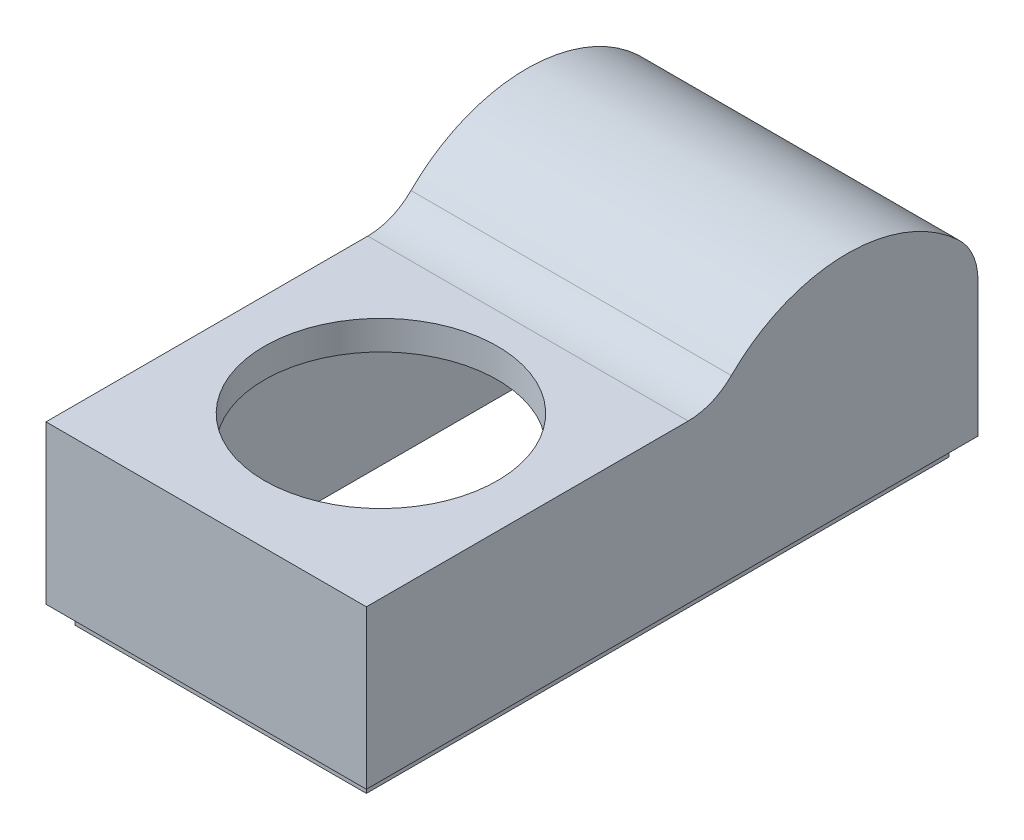
ISO-10303-21;
HEADER;
FILE_DESCRIPTION(('STEP AP214'),'2;1');
FILE_NAME('part.step','',(''),(''),'','','');
FILE_SCHEMA(('AUTOMOTIVE_DESIGN { 1 0 10303 214 1 1 1 1 }'));
ENDSEC;
DATA;
#1=APPLICATION_CONTEXT('core data for automotive mechanical design processes');
#2=APPLICATION_PROTOCOL_DEFINITION('international standard','automotive_design',2000,#1);
#3=PRODUCT_CONTEXT('',#1,'mechanical');
#4=PRODUCT('Part','Part','',(#3));
#5=PRODUCT_RELATED_PRODUCT_CATEGORY('part','',(#4));
#6=PRODUCT_DEFINITION_FORMATION('','',#4);
#7=PRODUCT_DEFINITION_CONTEXT('part definition',#1,'design');
#8=PRODUCT_DEFINITION('design','',#6,#7);
#9=PRODUCT_DEFINITION_SHAPE('','',#8);
#10=(LENGTH_UNIT() NAMED_UNIT(*) SI_UNIT(.MILLI.,.METRE.));
#11=(NAMED_UNIT(*) PLANE_ANGLE_UNIT() SI_UNIT($,.RADIAN.));
#12=(NAMED_UNIT(*) SI_UNIT($,.STERADIAN.) SOLID_ANGLE_UNIT());
#13=UNCERTAINTY_MEASURE_WITH_UNIT(LENGTH_MEASURE(1.E-05),#10,'distance_accuracy_value','');
#14=(GEOMETRIC_REPRESENTATION_CONTEXT(3) GLOBAL_UNCERTAINTY_ASSIGNED_CONTEXT((#13)) GLOBAL_UNIT_ASSIGNED_CONTEXT((#10,
#11,#12)) REPRESENTATION_CONTEXT('',''));
#15=CARTESIAN_POINT('',(0.,0.,0.));
#16=DIRECTION('',(0.,0.,1.));
#17=DIRECTION('',(1.,0.,0.));
#18=AXIS2_PLACEMENT_3D('',#15,#16,#17);
#19=CARTESIAN_POINT('',(0.,-9.74725,0.));
#20=DIRECTION('',(0.,1.,0.));
#21=DIRECTION('',(0.,0.,1.));
#22=AXIS2_PLACEMENT_3D('',#19,#20,#21);
#23=PLANE('',#22);
#24=DIRECTION('',(1.,0.,0.));
#25=VECTOR('',#24,1.);
#26=CARTESIAN_POINT('',(-12.7,-9.74725,-25.4));
#27=LINE('',#26,#25);
#28=CARTESIAN_POINT('',(-12.7,-9.74725,-25.4));
#29=VERTEX_POINT('',#28);
#30=CARTESIAN_POINT('',(-5.3975,-9.74725,-25.4));
#31=VERTEX_POINT('',#30);
#32=EDGE_CURVE('E49',#29,#31,#27,.T.);
#33=ORIENTED_EDGE('',*,*,#32,.F.);
#34=DIRECTION('',(0.,0.,-1.));
#35=VECTOR('',#34,1.);
#36=CARTESIAN_POINT('',(-12.7,-9.74725,25.4));
#37=LINE('',#36,#35);
#38=CARTESIAN_POINT('',(-12.7,-9.74725,25.4));
#39=VERTEX_POINT('',#38);
#40=EDGE_CURVE('E53',#39,#29,#37,.T.);
#41=ORIENTED_EDGE('',*,*,#40,.F.);
#42=DIRECTION('',(-1.,0.,0.));
#43=VECTOR('',#42,1.);
#44=CARTESIAN_POINT('',(12.7,-9.74725,25.4));
#45=LINE('',#44,#43);
#46=CARTESIAN_POINT('',(12.7,-9.74725,25.4));
#47=VERTEX_POINT('',#46);
#48=EDGE_CURVE('E251',#47,#39,#45,.T.);
#49=ORIENTED_EDGE('',*,*,#48,.F.);
#50=DIRECTION('',(0.,0.,1.));
#51=VECTOR('',#50,1.);
#52=CARTESIAN_POINT('',(12.7,-9.74725,-25.4));
#53=LINE('',#52,#51);
#54=CARTESIAN_POINT('',(12.7,-9.74725,-25.4));
#55=VERTEX_POINT('',#54);
#56=EDGE_CURVE('E248',#55,#47,#53,.T.);
#57=ORIENTED_EDGE('',*,*,#56,.F.);
#58=DIRECTION('',(1.,0.,0.));
#59=VECTOR('',#58,1.);
#60=CARTESIAN_POINT('',(5.3975,-9.74725,-25.4));
#61=LINE('',#60,#59);
#62=CARTESIAN_POINT('',(5.3975,-9.74725,-25.4));
#63=VERTEX_POINT('',#62);
#64=EDGE_CURVE('E245',#63,#55,#61,.T.);
#65=ORIENTED_EDGE('',*,*,#64,.F.);
#66=DIRECTION('',(0.,0.,-1.));
#67=VECTOR('',#66,1.);
#68=CARTESIAN_POINT('',(5.3975,-9.74725,-13.2188964238259));
#69=LINE('',#68,#67);
#70=CARTESIAN_POINT('',(5.3975,-9.74725,-26.67));
#71=VERTEX_POINT('',#70);
#72=EDGE_CURVE('E280',#63,#71,#69,.T.);
#73=ORIENTED_EDGE('',*,*,#72,.T.);
#74=DIRECTION('',(-1.,0.,0.));
#75=VECTOR('',#74,1.);
#76=CARTESIAN_POINT('',(-13.97,-9.74725,-26.67));
#77=LINE('',#76,#75);
#78=CARTESIAN_POINT('',(13.97,-9.74725,-26.67));
#79=VERTEX_POINT('',#78);
#80=EDGE_CURVE('E351',#79,#71,#77,.T.);
#81=ORIENTED_EDGE('',*,*,#80,.F.);
#82=DIRECTION('',(0.,0.,-1.));
#83=VECTOR('',#82,1.);
#84=CARTESIAN_POINT('',(13.97,-9.74725,-26.67));
#85=LINE('',#84,#83);
#86=CARTESIAN_POINT('',(13.97,-9.74725,26.67));
#87=VERTEX_POINT('',#86);
#88=EDGE_CURVE('E347',#87,#79,#85,.T.);
#89=ORIENTED_EDGE('',*,*,#88,.F.);
#90=DIRECTION('',(1.,0.,0.));
#91=VECTOR('',#90,1.);
#92=CARTESIAN_POINT('',(-13.97,-9.74725,26.67));
#93=LINE('',#92,#91);
#94=CARTESIAN_POINT('',(-13.97,-9.74725,26.67));
#95=VERTEX_POINT('',#94);
#96=EDGE_CURVE('E344',#95,#87,#93,.T.);
#97=ORIENTED_EDGE('',*,*,#96,.F.);
#98=DIRECTION('',(0.,0.,1.));
#99=VECTOR('',#98,1.);
#100=CARTESIAN_POINT('',(-13.97,-9.74725,-26.67));
#101=LINE('',#100,#99);
#102=CARTESIAN_POINT('',(-13.97,-9.74725,-26.67));
#103=VERTEX_POINT('',#102);
#104=EDGE_CURVE('E341',#103,#95,#101,.T.);
#105=ORIENTED_EDGE('',*,*,#104,.F.);
#106=CARTESIAN_POINT('',(-5.3975,-9.74725,-26.67));
#107=VERTEX_POINT('',#106);
#108=EDGE_CURVE('E350',#107,#103,#77,.T.);
#109=ORIENTED_EDGE('',*,*,#108,.F.);
#110=DIRECTION('',(0.,0.,-1.));
#111=VECTOR('',#110,1.);
#112=CARTESIAN_POINT('',(-5.3975,-9.74725,-13.2188964238259));
#113=LINE('',#112,#111);
#114=EDGE_CURVE('E203',#31,#107,#113,.T.);
#115=ORIENTED_EDGE('',*,*,#114,.F.);
#116=EDGE_LOOP('',(#33,#41,#49,#57,#65,#73,#81,#89,#97,#105,#109,#115));
#117=FACE_BOUND('',#116,.T.);
#118=ADVANCED_FACE('F33',(#117),#23,.F.);
#119=CARTESIAN_POINT('',(-13.97,9.74725,-26.67));
#120=DIRECTION('',(1.,0.,0.));
#121=DIRECTION('',(0.,0.,-1.));
#122=AXIS2_PLACEMENT_3D('',#119,#120,#121);
#123=PLANE('',#122);
#124=CARTESIAN_POINT('',(-13.97,-4.54025,-15.24));
#125=DIRECTION('',(1.,0.,0.));
#126=DIRECTION('',(0.,0.,-1.));
#127=AXIS2_PLACEMENT_3D('',#124,#125,#126);
#128=CIRCLE('',#127,14.2875);
#129=CARTESIAN_POINT('',(-13.97,5.92422779171323,-24.9676595744681));
#130=VERTEX_POINT('',#129);
#131=CARTESIAN_POINT('',(-13.97,5.58584223300971,-5.16056984058223));
#132=VERTEX_POINT('',#131);
#133=EDGE_CURVE('E332',#130,#132,#128,.T.);
#134=ORIENTED_EDGE('',*,*,#133,.F.);
#135=CARTESIAN_POINT('',(-13.97,2.01748941614029,-21.336));
#136=DIRECTION('',(1.,0.,0.));
#137=DIRECTION('',(0.,0.,-1.));
#138=AXIS2_PLACEMENT_3D('',#135,#136,#137);
#139=CIRCLE('',#138,5.334);
#140=CARTESIAN_POINT('',(-13.97,2.01748941614029,-26.67));
#141=VERTEX_POINT('',#140);
#142=EDGE_CURVE('E11',#130,#141,#139,.F.);
#143=ORIENTED_EDGE('',*,*,#142,.T.);
#144=DIRECTION('',(0.,-1.,0.));
#145=VECTOR('',#144,1.);
#146=CARTESIAN_POINT('',(-13.97,9.74725,-26.67));
#147=LINE('',#146,#145);
#148=EDGE_CURVE('E354',#141,#103,#147,.T.);
#149=ORIENTED_EDGE('',*,*,#148,.T.);
#150=ORIENTED_EDGE('',*,*,#104,.T.);
#151=DIRECTION('',(0.,-1.,0.));
#152=VECTOR('',#151,1.);
#153=CARTESIAN_POINT('',(-13.97,9.74725,26.67));
#154=LINE('',#153,#152);
#155=CARTESIAN_POINT('',(-13.97,4.03225,26.67));
#156=VERTEX_POINT('',#155);
#157=EDGE_CURVE('E361',#156,#95,#154,.T.);
#158=ORIENTED_EDGE('',*,*,#157,.F.);
#159=DIRECTION('',(0.,0.,1.));
#160=VECTOR('',#159,1.);
#161=CARTESIAN_POINT('',(-13.97,4.03225,0.));
#162=LINE('',#161,#160);
#163=CARTESIAN_POINT('',(-13.97,4.03225,-1.39758258106627));
#164=VERTEX_POINT('',#163);
#165=EDGE_CURVE('E330',#164,#156,#162,.T.);
#166=ORIENTED_EDGE('',*,*,#165,.F.);
#167=CARTESIAN_POINT('',(-13.97,9.36625,-1.39758258106627));
#168=DIRECTION('',(1.,0.,0.));
#169=DIRECTION('',(0.,0.,-1.));
#170=AXIS2_PLACEMENT_3D('',#167,#168,#169);
#171=CIRCLE('',#170,5.334);
#172=EDGE_CURVE('E370',#164,#132,#171,.T.);
#173=ORIENTED_EDGE('',*,*,#172,.T.);
#174=EDGE_LOOP('',(#134,#143,#149,#150,#158,#166,#173));
#175=FACE_BOUND('',#174,.T.);
#176=ADVANCED_FACE('F386',(#175),#123,.F.);
#177=CARTESIAN_POINT('',(13.97,9.74725,-26.67));
#178=DIRECTION('',(-1.,0.,0.));
#179=DIRECTION('',(0.,0.,1.));
#180=AXIS2_PLACEMENT_3D('',#177,#178,#179);
#181=PLANE('',#180);
#182=DIRECTION('',(0.,-1.,0.));
#183=VECTOR('',#182,1.);
#184=CARTESIAN_POINT('',(13.97,9.74725,-26.67));
#185=LINE('',#184,#183);
#186=CARTESIAN_POINT('',(13.97,2.01748941614029,-26.67));
#187=VERTEX_POINT('',#186);
#188=EDGE_CURVE('E357',#187,#79,#185,.T.);
#189=ORIENTED_EDGE('',*,*,#188,.F.);
#190=CARTESIAN_POINT('',(13.97,2.01748941614029,-21.336));
#191=DIRECTION('',(-1.,0.,0.));
#192=DIRECTION('',(0.,0.,1.));
#193=AXIS2_PLACEMENT_3D('',#190,#191,#192);
#194=CIRCLE('',#193,5.334);
#195=CARTESIAN_POINT('',(13.97,5.92422779171323,-24.9676595744681));
#196=VERTEX_POINT('',#195);
#197=EDGE_CURVE('E376',#187,#196,#194,.F.);
#198=ORIENTED_EDGE('',*,*,#197,.T.);
#199=CARTESIAN_POINT('',(13.97,-4.54025,-15.24));
#200=DIRECTION('',(1.,0.,0.));
#201=DIRECTION('',(0.,0.,-1.));
#202=AXIS2_PLACEMENT_3D('',#199,#200,#201);
#203=CIRCLE('',#202,14.2875);
#204=CARTESIAN_POINT('',(13.97,5.58584223300971,-5.16056984058224));
#205=VERTEX_POINT('',#204);
#206=EDGE_CURVE('E336',#205,#196,#203,.F.);
#207=ORIENTED_EDGE('',*,*,#206,.F.);
#208=CARTESIAN_POINT('',(13.97,9.36625,-1.39758258106627));
#209=DIRECTION('',(-1.,0.,0.));
#210=DIRECTION('',(0.,0.,1.));
#211=AXIS2_PLACEMENT_3D('',#208,#209,#210);
#212=CIRCLE('',#211,5.334);
#213=CARTESIAN_POINT('',(13.97,4.03225,-1.39758258106627));
#214=VERTEX_POINT('',#213);
#215=EDGE_CURVE('E368',#205,#214,#212,.T.);
#216=ORIENTED_EDGE('',*,*,#215,.T.);
#217=DIRECTION('',(0.,0.,-1.));
#218=VECTOR('',#217,1.);
#219=CARTESIAN_POINT('',(13.97,4.03225,0.));
#220=LINE('',#219,#218);
#221=CARTESIAN_POINT('',(13.97,4.03225,26.67));
#222=VERTEX_POINT('',#221);
#223=EDGE_CURVE('E296',#222,#214,#220,.T.);
#224=ORIENTED_EDGE('',*,*,#223,.F.);
#225=DIRECTION('',(0.,-1.,0.));
#226=VECTOR('',#225,1.);
#227=CARTESIAN_POINT('',(13.97,9.74725,26.67));
#228=LINE('',#227,#226);
#229=EDGE_CURVE('E359',#222,#87,#228,.T.);
#230=ORIENTED_EDGE('',*,*,#229,.T.);
#231=ORIENTED_EDGE('',*,*,#88,.T.);
#232=EDGE_LOOP('',(#189,#198,#207,#216,#224,#230,#231));
#233=FACE_BOUND('',#232,.T.);
#234=ADVANCED_FACE('F397',(#233),#181,.F.);
#235=CARTESIAN_POINT('',(-13.97,9.74725,26.67));
#236=DIRECTION('',(0.,0.,-1.));
#237=DIRECTION('',(-1.,0.,0.));
#238=AXIS2_PLACEMENT_3D('',#235,#236,#237);
#239=PLANE('',#238);
#240=ORIENTED_EDGE('',*,*,#229,.F.);
#241=DIRECTION('',(1.,0.,0.));
#242=VECTOR('',#241,1.);
#243=CARTESIAN_POINT('',(-56.2678643077875,4.03225,26.67));
#244=LINE('',#243,#242);
#245=EDGE_CURVE('E333',#156,#222,#244,.T.);
#246=ORIENTED_EDGE('',*,*,#245,.F.);
#247=ORIENTED_EDGE('',*,*,#157,.T.);
#248=ORIENTED_EDGE('',*,*,#96,.T.);
#249=EDGE_LOOP('',(#240,#246,#247,#248));
#250=FACE_BOUND('',#249,.T.);
#251=ADVANCED_FACE('F418',(#250),#239,.F.);
#252=CARTESIAN_POINT('',(-13.97,9.74725,-26.67));
#253=DIRECTION('',(0.,0.,1.));
#254=DIRECTION('',(1.,0.,0.));
#255=AXIS2_PLACEMENT_3D('',#252,#253,#254);
#256=PLANE('',#255);
#257=DIRECTION('',(1.,0.,0.));
#258=VECTOR('',#257,1.);
#259=CARTESIAN_POINT('',(5.3975,-8.15975,-26.67));
#260=LINE('',#259,#258);
#261=CARTESIAN_POINT('',(-5.3975,-8.15975,-26.67));
#262=VERTEX_POINT('',#261);
#263=CARTESIAN_POINT('',(5.3975,-8.15975,-26.67));
#264=VERTEX_POINT('',#263);
#265=EDGE_CURVE('E271',#262,#264,#260,.T.);
#266=ORIENTED_EDGE('',*,*,#265,.F.);
#267=DIRECTION('',(0.,1.,0.));
#268=VECTOR('',#267,1.);
#269=CARTESIAN_POINT('',(-5.3975,-9.74725,-26.67));
#270=LINE('',#269,#268);
#271=EDGE_CURVE('E274',#107,#262,#270,.T.);
#272=ORIENTED_EDGE('',*,*,#271,.F.);
#273=ORIENTED_EDGE('',*,*,#108,.T.);
#274=ORIENTED_EDGE('',*,*,#148,.F.);
#275=DIRECTION('',(1.,0.,0.));
#276=VECTOR('',#275,1.);
#277=CARTESIAN_POINT('',(-13.97,2.01748941614029,-26.67));
#278=LINE('',#277,#276);
#279=EDGE_CURVE('E373',#141,#187,#278,.T.);
#280=ORIENTED_EDGE('',*,*,#279,.T.);
#281=ORIENTED_EDGE('',*,*,#188,.T.);
#282=ORIENTED_EDGE('',*,*,#80,.T.);
#283=DIRECTION('',(0.,-1.,0.));
#284=VECTOR('',#283,1.);
#285=CARTESIAN_POINT('',(5.3975,-9.74725,-26.67));
#286=LINE('',#285,#284);
#287=EDGE_CURVE('E270',#264,#71,#286,.T.);
#288=ORIENTED_EDGE('',*,*,#287,.F.);
#289=EDGE_LOOP('',(#266,#272,#273,#274,#280,#281,#282,#288));
#290=FACE_BOUND('',#289,.T.);
#291=ADVANCED_FACE('F395',(#290),#256,.F.);
#292=CARTESIAN_POINT('',(-56.2678643077875,4.03225,0.));
#293=DIRECTION('',(0.,-1.,0.));
#294=DIRECTION('',(0.,0.,-1.));
#295=AXIS2_PLACEMENT_3D('',#292,#293,#294);
#296=PLANE('',#295);
#297=CARTESIAN_POINT('',(0.,4.03225,11.43));
#298=DIRECTION('',(0.,1.,0.));
#299=DIRECTION('',(0.,0.,1.));
#300=AXIS2_PLACEMENT_3D('',#297,#298,#299);
#301=CIRCLE('',#300,10.16);
#302=CARTESIAN_POINT('',(0.,4.03225,21.59));
#303=VERTEX_POINT('',#302);
#304=EDGE_CURVE('E288',#303,#303,#301,.T.);
#305=ORIENTED_EDGE('',*,*,#304,.F.);
#306=EDGE_LOOP('',(#305));
#307=FACE_BOUND('',#306,.T.);
#308=ORIENTED_EDGE('',*,*,#223,.T.);
#309=DIRECTION('',(-1.,0.,0.));
#310=VECTOR('',#309,1.);
#311=CARTESIAN_POINT('',(-13.97,4.03225,-1.39758258106627));
#312=LINE('',#311,#310);
#313=EDGE_CURVE('E366',#214,#164,#312,.T.);
#314=ORIENTED_EDGE('',*,*,#313,.T.);
#315=ORIENTED_EDGE('',*,*,#165,.T.);
#316=ORIENTED_EDGE('',*,*,#245,.T.);
#317=EDGE_LOOP('',(#308,#314,#315,#316));
#318=FACE_BOUND('',#317,.T.);
#319=ADVANCED_FACE('F420',(#307,#318),#296,.F.);
#320=CARTESIAN_POINT('',(-56.2678643077875,-4.54025,-15.24));
#321=DIRECTION('',(1.,0.,0.));
#322=DIRECTION('',(0.,0.,-1.));
#323=AXIS2_PLACEMENT_3D('',#320,#321,#322);
#324=CYLINDRICAL_SURFACE('',#323,14.2875);
#325=ORIENTED_EDGE('',*,*,#206,.T.);
#326=DIRECTION('',(1.,0.,0.));
#327=VECTOR('',#326,1.);
#328=CARTESIAN_POINT('',(-56.2678643077875,5.92422779171323,-24.9676595744681));
#329=LINE('',#328,#327);
#330=EDGE_CURVE('E42',#196,#130,#329,.F.);
#331=ORIENTED_EDGE('',*,*,#330,.T.);
#332=ORIENTED_EDGE('',*,*,#133,.T.);
#333=DIRECTION('',(1.,0.,0.));
#334=VECTOR('',#333,1.);
#335=CARTESIAN_POINT('',(-56.2678643077875,5.58584223300971,-5.16056984058222));
#336=LINE('',#335,#334);
#337=EDGE_CURVE('E363',#132,#205,#336,.T.);
#338=ORIENTED_EDGE('',*,*,#337,.T.);
#339=EDGE_LOOP('',(#325,#331,#332,#338));
#340=FACE_BOUND('',#339,.T.);
#341=ADVANCED_FACE('F381',(#340),#324,.T.);
#342=CARTESIAN_POINT('',(-56.2678643077875,9.36625,-1.39758258106626));
#343=DIRECTION('',(1.,0.,0.));
#344=DIRECTION('',(0.,0.,-1.));
#345=AXIS2_PLACEMENT_3D('',#342,#343,#344);
#346=CYLINDRICAL_SURFACE('',#345,5.334);
#347=ORIENTED_EDGE('',*,*,#172,.F.);
#348=ORIENTED_EDGE('',*,*,#313,.F.);
#349=ORIENTED_EDGE('',*,*,#215,.F.);
#350=ORIENTED_EDGE('',*,*,#337,.F.);
#351=EDGE_LOOP('',(#347,#348,#349,#350));
#352=FACE_BOUND('',#351,.T.);
#353=ADVANCED_FACE('F423',(#352),#346,.F.);
#354=CARTESIAN_POINT('',(-56.2678643077875,2.01748941614029,-21.336));
#355=DIRECTION('',(1.,0.,0.));
#356=DIRECTION('',(0.,0.,-1.));
#357=AXIS2_PLACEMENT_3D('',#354,#355,#356);
#358=CYLINDRICAL_SURFACE('',#357,5.334);
#359=ORIENTED_EDGE('',*,*,#142,.F.);
#360=ORIENTED_EDGE('',*,*,#330,.F.);
#361=ORIENTED_EDGE('',*,*,#197,.F.);
#362=ORIENTED_EDGE('',*,*,#279,.F.);
#363=EDGE_LOOP('',(#359,#360,#361,#362));
#364=FACE_BOUND('',#363,.T.);
#365=ADVANCED_FACE('F35',(#364),#358,.T.);
#366=CARTESIAN_POINT('',(-11.43,9.74725,-26.67));
#367=DIRECTION('',(1.,0.,0.));
#368=DIRECTION('',(0.,0.,-1.));
#369=AXIS2_PLACEMENT_3D('',#366,#367,#368);
#370=PLANE('',#369);
#371=CARTESIAN_POINT('',(-11.43,-4.54025,-15.24));
#372=DIRECTION('',(1.,0.,0.));
#373=DIRECTION('',(0.,0.,-1.));
#374=AXIS2_PLACEMENT_3D('',#371,#372,#373);
#375=CIRCLE('',#374,11.7475);
#376=CARTESIAN_POINT('',(-11.43,4.06387618429754,-23.2382978723404));
#377=VERTEX_POINT('',#376);
#378=CARTESIAN_POINT('',(-11.43,3.78564805825243,-6.95246853558983));
#379=VERTEX_POINT('',#378);
#380=EDGE_CURVE('E291',#377,#379,#375,.T.);
#381=ORIENTED_EDGE('',*,*,#380,.T.);
#382=CARTESIAN_POINT('',(-11.43,9.36625,-1.39758258106627));
#383=DIRECTION('',(1.,0.,0.));
#384=DIRECTION('',(0.,0.,-1.));
#385=AXIS2_PLACEMENT_3D('',#382,#383,#384);
#386=CIRCLE('',#385,7.874);
#387=CARTESIAN_POINT('',(-11.43,1.49225000000001,-1.39758258106627));
#388=VERTEX_POINT('',#387);
#389=EDGE_CURVE('E306',#388,#379,#386,.T.);
#390=ORIENTED_EDGE('',*,*,#389,.F.);
#391=DIRECTION('',(0.,0.,1.));
#392=VECTOR('',#391,1.);
#393=CARTESIAN_POINT('',(-11.43,1.49225000000001,0.));
#394=LINE('',#393,#392);
#395=CARTESIAN_POINT('',(-11.43,1.49225000000001,24.13));
#396=VERTEX_POINT('',#395);
#397=EDGE_CURVE('E293',#388,#396,#394,.T.);
#398=ORIENTED_EDGE('',*,*,#397,.T.);
#399=DIRECTION('',(0.,-1.,0.));
#400=VECTOR('',#399,1.);
#401=CARTESIAN_POINT('',(-11.43,9.74725,24.13));
#402=LINE('',#401,#400);
#403=CARTESIAN_POINT('',(-11.43,-11.33475,24.13));
#404=VERTEX_POINT('',#403);
#405=EDGE_CURVE('E300',#396,#404,#402,.T.);
#406=ORIENTED_EDGE('',*,*,#405,.T.);
#407=DIRECTION('',(0.,0.,1.));
#408=VECTOR('',#407,1.);
#409=CARTESIAN_POINT('',(-11.43,-11.33475,-24.13));
#410=LINE('',#409,#408);
#411=CARTESIAN_POINT('',(-11.43,-11.33475,-24.13));
#412=VERTEX_POINT('',#411);
#413=EDGE_CURVE('E214',#412,#404,#410,.T.);
#414=ORIENTED_EDGE('',*,*,#413,.F.);
#415=DIRECTION('',(0.,-1.,0.));
#416=VECTOR('',#415,1.);
#417=CARTESIAN_POINT('',(-11.43,9.74725,-24.13));
#418=LINE('',#417,#416);
#419=CARTESIAN_POINT('',(-11.43,2.01748941614029,-24.13));
#420=VERTEX_POINT('',#419);
#421=EDGE_CURVE('E210',#420,#412,#418,.T.);
#422=ORIENTED_EDGE('',*,*,#421,.F.);
#423=CARTESIAN_POINT('',(-11.43,2.01748941614029,-21.336));
#424=DIRECTION('',(1.,0.,0.));
#425=DIRECTION('',(0.,0.,-1.));
#426=AXIS2_PLACEMENT_3D('',#423,#424,#425);
#427=CIRCLE('',#426,2.794);
#428=EDGE_CURVE('E294',#377,#420,#427,.F.);
#429=ORIENTED_EDGE('',*,*,#428,.F.);
#430=EDGE_LOOP('',(#381,#390,#398,#406,#414,#422,#429));
#431=FACE_BOUND('',#430,.T.);
#432=ADVANCED_FACE('F429',(#431),#370,.T.);
#433=CARTESIAN_POINT('',(11.43,9.74725,-26.67));
#434=DIRECTION('',(-1.,0.,0.));
#435=DIRECTION('',(0.,0.,1.));
#436=AXIS2_PLACEMENT_3D('',#433,#434,#435);
#437=PLANE('',#436);
#438=DIRECTION('',(0.,-1.,0.));
#439=VECTOR('',#438,1.);
#440=CARTESIAN_POINT('',(11.43,9.74725,-24.13));
#441=LINE('',#440,#439);
#442=CARTESIAN_POINT('',(11.43,2.01748941614029,-24.13));
#443=VERTEX_POINT('',#442);
#444=CARTESIAN_POINT('',(11.43,-11.33475,-24.13));
#445=VERTEX_POINT('',#444);
#446=EDGE_CURVE('E299',#443,#445,#441,.T.);
#447=ORIENTED_EDGE('',*,*,#446,.T.);
#448=DIRECTION('',(0.,0.,-1.));
#449=VECTOR('',#448,1.);
#450=CARTESIAN_POINT('',(11.43,-11.33475,24.13));
#451=LINE('',#450,#449);
#452=CARTESIAN_POINT('',(11.43,-11.33475,24.13));
#453=VERTEX_POINT('',#452);
#454=EDGE_CURVE('E227',#453,#445,#451,.T.);
#455=ORIENTED_EDGE('',*,*,#454,.F.);
#456=DIRECTION('',(0.,-1.,0.));
#457=VECTOR('',#456,1.);
#458=CARTESIAN_POINT('',(11.43,9.74725,24.13));
#459=LINE('',#458,#457);
#460=CARTESIAN_POINT('',(11.43,1.49225000000001,24.13));
#461=VERTEX_POINT('',#460);
#462=EDGE_CURVE('E303',#461,#453,#459,.T.);
#463=ORIENTED_EDGE('',*,*,#462,.F.);
#464=DIRECTION('',(0.,0.,-1.));
#465=VECTOR('',#464,1.);
#466=CARTESIAN_POINT('',(11.43,1.49225000000001,0.));
#467=LINE('',#466,#465);
#468=CARTESIAN_POINT('',(11.43,1.49225000000001,-1.39758258106627));
#469=VERTEX_POINT('',#468);
#470=EDGE_CURVE('E319',#461,#469,#467,.T.);
#471=ORIENTED_EDGE('',*,*,#470,.T.);
#472=CARTESIAN_POINT('',(11.43,9.36625,-1.39758258106627));
#473=DIRECTION('',(-1.,0.,0.));
#474=DIRECTION('',(0.,0.,1.));
#475=AXIS2_PLACEMENT_3D('',#472,#473,#474);
#476=CIRCLE('',#475,7.874);
#477=CARTESIAN_POINT('',(11.43,3.78564805825243,-6.95246853558984));
#478=VERTEX_POINT('',#477);
#479=EDGE_CURVE('E310',#478,#469,#476,.T.);
#480=ORIENTED_EDGE('',*,*,#479,.F.);
#481=CARTESIAN_POINT('',(11.43,-4.54025,-15.24));
#482=DIRECTION('',(-1.,0.,0.));
#483=DIRECTION('',(0.,0.,1.));
#484=AXIS2_PLACEMENT_3D('',#481,#482,#483);
#485=CIRCLE('',#484,11.7475);
#486=CARTESIAN_POINT('',(11.43,4.06387618429754,-23.2382978723404));
#487=VERTEX_POINT('',#486);
#488=EDGE_CURVE('E313',#478,#487,#485,.T.);
#489=ORIENTED_EDGE('',*,*,#488,.T.);
#490=CARTESIAN_POINT('',(11.43,2.01748941614029,-21.336));
#491=DIRECTION('',(-1.,0.,0.));
#492=DIRECTION('',(0.,0.,1.));
#493=AXIS2_PLACEMENT_3D('',#490,#491,#492);
#494=CIRCLE('',#493,2.794);
#495=EDGE_CURVE('E315',#443,#487,#494,.F.);
#496=ORIENTED_EDGE('',*,*,#495,.F.);
#497=EDGE_LOOP('',(#447,#455,#463,#471,#480,#489,#496));
#498=FACE_BOUND('',#497,.T.);
#499=ADVANCED_FACE('F629',(#498),#437,.T.);
#500=CARTESIAN_POINT('',(-13.97,9.74725,24.13));
#501=DIRECTION('',(0.,0.,-1.));
#502=DIRECTION('',(-1.,0.,0.));
#503=AXIS2_PLACEMENT_3D('',#500,#501,#502);
#504=PLANE('',#503);
#505=ORIENTED_EDGE('',*,*,#462,.T.);
#506=DIRECTION('',(1.,0.,0.));
#507=VECTOR('',#506,1.);
#508=CARTESIAN_POINT('',(-11.43,-11.33475,24.13));
#509=LINE('',#508,#507);
#510=EDGE_CURVE('E224',#404,#453,#509,.T.);
#511=ORIENTED_EDGE('',*,*,#510,.F.);
#512=ORIENTED_EDGE('',*,*,#405,.F.);
#513=DIRECTION('',(1.,0.,0.));
#514=VECTOR('',#513,1.);
#515=CARTESIAN_POINT('',(-56.2678643077875,1.49225000000001,24.13));
#516=LINE('',#515,#514);
#517=EDGE_CURVE('E305',#396,#461,#516,.T.);
#518=ORIENTED_EDGE('',*,*,#517,.T.);
#519=EDGE_LOOP('',(#505,#511,#512,#518));
#520=FACE_BOUND('',#519,.T.);
#521=ADVANCED_FACE('F617',(#520),#504,.T.);
#522=CARTESIAN_POINT('',(-13.97,9.74725,-24.13));
#523=DIRECTION('',(0.,0.,1.));
#524=DIRECTION('',(1.,0.,0.));
#525=AXIS2_PLACEMENT_3D('',#522,#523,#524);
#526=PLANE('',#525);
#527=DIRECTION('',(0.,1.,0.));
#528=VECTOR('',#527,1.);
#529=CARTESIAN_POINT('',(-5.3975,-9.74725,-24.13));
#530=LINE('',#529,#528);
#531=CARTESIAN_POINT('',(-5.3975,-11.33475,-24.13));
#532=VERTEX_POINT('',#531);
#533=CARTESIAN_POINT('',(-5.3975,-8.15975,-24.13));
#534=VERTEX_POINT('',#533);
#535=EDGE_CURVE('E193',#532,#534,#530,.T.);
#536=ORIENTED_EDGE('',*,*,#535,.T.);
#537=DIRECTION('',(1.,0.,0.));
#538=VECTOR('',#537,1.);
#539=CARTESIAN_POINT('',(5.3975,-8.15975,-24.13));
#540=LINE('',#539,#538);
#541=CARTESIAN_POINT('',(5.3975,-8.15975,-24.13));
#542=VERTEX_POINT('',#541);
#543=EDGE_CURVE('E282',#534,#542,#540,.T.);
#544=ORIENTED_EDGE('',*,*,#543,.T.);
#545=DIRECTION('',(0.,-1.,0.));
#546=VECTOR('',#545,1.);
#547=CARTESIAN_POINT('',(5.3975,-9.74725,-24.13));
#548=LINE('',#547,#546);
#549=CARTESIAN_POINT('',(5.3975,-11.33475,-24.13));
#550=VERTEX_POINT('',#549);
#551=EDGE_CURVE('E278',#542,#550,#548,.T.);
#552=ORIENTED_EDGE('',*,*,#551,.T.);
#553=DIRECTION('',(-1.,0.,0.));
#554=VECTOR('',#553,1.);
#555=CARTESIAN_POINT('',(11.43,-11.33475,-24.13));
#556=LINE('',#555,#554);
#557=EDGE_CURVE('E230',#445,#550,#556,.T.);
#558=ORIENTED_EDGE('',*,*,#557,.F.);
#559=ORIENTED_EDGE('',*,*,#446,.F.);
#560=DIRECTION('',(1.,0.,0.));
#561=VECTOR('',#560,1.);
#562=CARTESIAN_POINT('',(-13.97,2.01748941614029,-24.13));
#563=LINE('',#562,#561);
#564=EDGE_CURVE('E309',#420,#443,#563,.T.);
#565=ORIENTED_EDGE('',*,*,#564,.F.);
#566=ORIENTED_EDGE('',*,*,#421,.T.);
#567=DIRECTION('',(-1.,0.,0.));
#568=VECTOR('',#567,1.);
#569=CARTESIAN_POINT('',(-5.3975,-11.33475,-24.13));
#570=LINE('',#569,#568);
#571=EDGE_CURVE('E206',#532,#412,#570,.T.);
#572=ORIENTED_EDGE('',*,*,#571,.F.);
#573=EDGE_LOOP('',(#536,#544,#552,#558,#559,#565,#566,#572));
#574=FACE_BOUND('',#573,.T.);
#575=ADVANCED_FACE('F207',(#574),#526,.T.);
#576=CARTESIAN_POINT('',(-56.2678643077875,1.49225000000001,0.));
#577=DIRECTION('',(0.,-1.,0.));
#578=DIRECTION('',(0.,0.,-1.));
#579=AXIS2_PLACEMENT_3D('',#576,#577,#578);
#580=PLANE('',#579);
#581=CARTESIAN_POINT('',(0.,1.49225,11.43));
#582=DIRECTION('',(0.,-1.,0.));
#583=DIRECTION('',(0.,0.,-1.));
#584=AXIS2_PLACEMENT_3D('',#581,#582,#583);
#585=CIRCLE('',#584,10.16);
#586=CARTESIAN_POINT('',(0.,1.49225,21.59));
#587=VERTEX_POINT('',#586);
#588=EDGE_CURVE('E37',#587,#587,#585,.T.);
#589=ORIENTED_EDGE('',*,*,#588,.F.);
#590=EDGE_LOOP('',(#589));
#591=FACE_BOUND('',#590,.T.);
#592=ORIENTED_EDGE('',*,*,#470,.F.);
#593=ORIENTED_EDGE('',*,*,#517,.F.);
#594=ORIENTED_EDGE('',*,*,#397,.F.);
#595=DIRECTION('',(1.,0.,0.));
#596=VECTOR('',#595,1.);
#597=CARTESIAN_POINT('',(-56.2678643077875,1.49225000000001,-1.39758258106627));
#598=LINE('',#597,#596);
#599=EDGE_CURVE('E321',#469,#388,#598,.F.);
#600=ORIENTED_EDGE('',*,*,#599,.F.);
#601=EDGE_LOOP('',(#592,#593,#594,#600));
#602=FACE_BOUND('',#601,.T.);
#603=ADVANCED_FACE('F490',(#591,#602),#580,.T.);
#604=CARTESIAN_POINT('',(-56.2678643077875,-4.54025,-15.24));
#605=DIRECTION('',(1.,0.,0.));
#606=DIRECTION('',(0.,0.,-1.));
#607=AXIS2_PLACEMENT_3D('',#604,#605,#606);
#608=CYLINDRICAL_SURFACE('',#607,11.7475);
#609=ORIENTED_EDGE('',*,*,#488,.F.);
#610=DIRECTION('',(1.,0.,0.));
#611=VECTOR('',#610,1.);
#612=CARTESIAN_POINT('',(-56.2678643077875,3.78564805825243,-6.95246853558982));
#613=LINE('',#612,#611);
#614=EDGE_CURVE('E302',#379,#478,#613,.T.);
#615=ORIENTED_EDGE('',*,*,#614,.F.);
#616=ORIENTED_EDGE('',*,*,#380,.F.);
#617=DIRECTION('',(1.,0.,0.));
#618=VECTOR('',#617,1.);
#619=CARTESIAN_POINT('',(-56.2678643077875,4.06387618429754,-23.2382978723404));
#620=LINE('',#619,#618);
#621=EDGE_CURVE('E297',#487,#377,#620,.F.);
#622=ORIENTED_EDGE('',*,*,#621,.F.);
#623=EDGE_LOOP('',(#609,#615,#616,#622));
#624=FACE_BOUND('',#623,.T.);
#625=ADVANCED_FACE('F484',(#624),#608,.F.);
#626=CARTESIAN_POINT('',(-56.2678643077875,9.36625,-1.39758258106626));
#627=DIRECTION('',(1.,0.,0.));
#628=DIRECTION('',(0.,0.,-1.));
#629=AXIS2_PLACEMENT_3D('',#626,#627,#628);
#630=CYLINDRICAL_SURFACE('',#629,7.874);
#631=ORIENTED_EDGE('',*,*,#389,.T.);
#632=ORIENTED_EDGE('',*,*,#614,.T.);
#633=ORIENTED_EDGE('',*,*,#479,.T.);
#634=ORIENTED_EDGE('',*,*,#599,.T.);
#635=EDGE_LOOP('',(#631,#632,#633,#634));
#636=FACE_BOUND('',#635,.T.);
#637=ADVANCED_FACE('F489',(#636),#630,.T.);
#638=CARTESIAN_POINT('',(-56.2678643077875,2.01748941614029,-21.336));
#639=DIRECTION('',(1.,0.,0.));
#640=DIRECTION('',(0.,0.,-1.));
#641=AXIS2_PLACEMENT_3D('',#638,#639,#640);
#642=CYLINDRICAL_SURFACE('',#641,2.794);
#643=ORIENTED_EDGE('',*,*,#428,.T.);
#644=ORIENTED_EDGE('',*,*,#564,.T.);
#645=ORIENTED_EDGE('',*,*,#495,.T.);
#646=ORIENTED_EDGE('',*,*,#621,.T.);
#647=EDGE_LOOP('',(#643,#644,#645,#646));
#648=FACE_BOUND('',#647,.T.);
#649=ADVANCED_FACE('F501',(#648),#642,.F.);
#650=CARTESIAN_POINT('',(0.,-20.09775,11.43));
#651=DIRECTION('',(0.,1.,0.));
#652=DIRECTION('',(0.,0.,1.));
#653=AXIS2_PLACEMENT_3D('',#650,#651,#652);
#654=CYLINDRICAL_SURFACE('',#653,10.16);
#655=CARTESIAN_POINT('',(0.,1.49225,21.59));
#656=CARTESIAN_POINT('',(0.,1.51870833333333,21.59));
#657=CARTESIAN_POINT('',(0.,1.54516666666667,21.59));
#658=CARTESIAN_POINT('',(0.,1.59808333333333,21.59));
#659=CARTESIAN_POINT('',(0.,1.62454166666667,21.59));
#660=CARTESIAN_POINT('',(0.,1.67745833333333,21.59));
#661=CARTESIAN_POINT('',(0.,1.70391666666667,21.59));
#662=CARTESIAN_POINT('',(0.,1.75683333333333,21.59));
#663=CARTESIAN_POINT('',(0.,1.78329166666667,21.59));
#664=CARTESIAN_POINT('',(0.,1.83620833333333,21.59));
#665=CARTESIAN_POINT('',(0.,1.86266666666667,21.59));
#666=CARTESIAN_POINT('',(0.,1.91558333333334,21.59));
#667=CARTESIAN_POINT('',(0.,1.94204166666667,21.59));
#668=CARTESIAN_POINT('',(0.,1.99495833333333,21.59));
#669=CARTESIAN_POINT('',(0.,2.02141666666667,21.59));
#670=CARTESIAN_POINT('',(0.,2.07433333333333,21.59));
#671=CARTESIAN_POINT('',(0.,2.10079166666667,21.59));
#672=CARTESIAN_POINT('',(0.,2.15370833333333,21.59));
#673=CARTESIAN_POINT('',(0.,2.18016666666667,21.59));
#674=CARTESIAN_POINT('',(0.,2.23308333333333,21.59));
#675=CARTESIAN_POINT('',(0.,2.25954166666667,21.59));
#676=CARTESIAN_POINT('',(0.,2.31245833333333,21.59));
#677=CARTESIAN_POINT('',(0.,2.33891666666667,21.59));
#678=CARTESIAN_POINT('',(0.,2.39183333333333,21.59));
#679=CARTESIAN_POINT('',(0.,2.41829166666667,21.59));
#680=CARTESIAN_POINT('',(0.,2.47120833333334,21.59));
#681=CARTESIAN_POINT('',(0.,2.49766666666667,21.59));
#682=CARTESIAN_POINT('',(0.,2.55058333333334,21.59));
#683=CARTESIAN_POINT('',(0.,2.57704166666667,21.59));
#684=CARTESIAN_POINT('',(0.,2.62995833333333,21.59));
#685=CARTESIAN_POINT('',(0.,2.65641666666667,21.59));
#686=CARTESIAN_POINT('',(0.,2.70933333333333,21.59));
#687=CARTESIAN_POINT('',(0.,2.73579166666667,21.59));
#688=CARTESIAN_POINT('',(0.,2.78870833333333,21.59));
#689=CARTESIAN_POINT('',(0.,2.81516666666667,21.59));
#690=CARTESIAN_POINT('',(0.,2.86808333333333,21.59));
#691=CARTESIAN_POINT('',(0.,2.89454166666667,21.59));
#692=CARTESIAN_POINT('',(0.,2.94745833333333,21.59));
#693=CARTESIAN_POINT('',(0.,2.97391666666667,21.59));
#694=CARTESIAN_POINT('',(0.,3.02683333333333,21.59));
#695=CARTESIAN_POINT('',(0.,3.05329166666667,21.59));
#696=CARTESIAN_POINT('',(0.,3.10620833333333,21.59));
#697=CARTESIAN_POINT('',(0.,3.13266666666667,21.59));
#698=CARTESIAN_POINT('',(0.,3.18558333333334,21.59));
#699=CARTESIAN_POINT('',(0.,3.21204166666667,21.59));
#700=CARTESIAN_POINT('',(0.,3.26495833333334,21.59));
#701=CARTESIAN_POINT('',(0.,3.29141666666667,21.59));
#702=CARTESIAN_POINT('',(0.,3.34433333333333,21.59));
#703=CARTESIAN_POINT('',(0.,3.37079166666667,21.59));
#704=CARTESIAN_POINT('',(0.,3.42370833333333,21.59));
#705=CARTESIAN_POINT('',(0.,3.45016666666667,21.59));
#706=CARTESIAN_POINT('',(0.,3.50308333333333,21.59));
#707=CARTESIAN_POINT('',(0.,3.52954166666667,21.59));
#708=CARTESIAN_POINT('',(0.,3.58245833333333,21.59));
#709=CARTESIAN_POINT('',(0.,3.60891666666667,21.59));
#710=CARTESIAN_POINT('',(0.,3.66183333333333,21.59));
#711=CARTESIAN_POINT('',(0.,3.68829166666667,21.59));
#712=CARTESIAN_POINT('',(0.,3.74120833333334,21.59));
#713=CARTESIAN_POINT('',(0.,3.76766666666667,21.59));
#714=CARTESIAN_POINT('',(0.,3.82058333333334,21.59));
#715=CARTESIAN_POINT('',(0.,3.84704166666667,21.59));
#716=CARTESIAN_POINT('',(0.,3.89995833333333,21.59));
#717=CARTESIAN_POINT('',(0.,3.92641666666667,21.59));
#718=CARTESIAN_POINT('',(0.,3.97933333333333,21.59));
#719=CARTESIAN_POINT('',(0.,4.00579166666667,21.59));
#720=CARTESIAN_POINT('',(0.,4.03225,21.59));
#721=B_SPLINE_CURVE_WITH_KNOTS('',3,(#655,#656,#657,#658,#659,#660,#661,#662,#663,#664,#665,
#666,#667,#668,#669,#670,#671,#672,#673,#674,#675,#676,#677,#678,#679,#680,#681,#682,#683,#684,
#685,#686,#687,#688,#689,#690,#691,#692,#693,#694,#695,#696,#697,#698,#699,#700,#701,#702,#703,
#704,#705,#706,#707,#708,#709,#710,#711,#712,#713,#714,#715,#716,#717,#718,#719,#720),
.UNSPECIFIED.,.F.,.F.,(4,2,2,2,2,2,2,2,2,2,2,2,2,2,2,2,2,2,2,2,2,2,2,2,2,2,2,2,2,2,2,2,4),(0.,
0.0793749999999996,0.158749999999999,0.238124999999999,0.317499999999998,0.396875000000001,
0.476250000000001,0.555625000000001,0.635,0.714375,0.793749999999999,0.873124999999999,
0.952500000000002,1.031875,1.11125,1.190625,1.27,1.349375,1.42875,1.508125,1.5875,1.666875,
1.74625,1.825625,1.905,1.984375,2.06375,2.143125,2.2225,2.301875,2.38125,2.460625,2.54),.UNSPECIFIED.);
#722=EDGE_CURVE('BSEAM510',#587,#303,#721,.T.);
#723=ORIENTED_EDGE('',*,*,#588,.T.);
#724=ORIENTED_EDGE('',*,*,#304,.T.);
#725=ORIENTED_EDGE('',*,*,#722,.T.);
#726=ORIENTED_EDGE('',*,*,#722,.F.);
#727=EDGE_LOOP('',(#723,#725,#724,#726));
#728=FACE_BOUND('',#727,.T.);
#729=ADVANCED_FACE('F510',(#728),#654,.F.);
#730=CARTESIAN_POINT('',(-5.3975,-9.74725,-13.2188964238259));
#731=DIRECTION('',(-1.,0.,0.));
#732=DIRECTION('',(0.,0.,1.));
#733=AXIS2_PLACEMENT_3D('',#730,#731,#732);
#734=PLANE('',#733);
#735=ORIENTED_EDGE('',*,*,#535,.F.);
#736=DIRECTION('',(0.,0.,1.));
#737=VECTOR('',#736,1.);
#738=CARTESIAN_POINT('',(-5.3975,-11.33475,-25.4));
#739=LINE('',#738,#737);
#740=CARTESIAN_POINT('',(-5.3975,-11.33475,-25.4));
#741=VERTEX_POINT('',#740);
#742=EDGE_CURVE('E198',#741,#532,#739,.T.);
#743=ORIENTED_EDGE('',*,*,#742,.F.);
#744=DIRECTION('',(0.,1.,0.));
#745=VECTOR('',#744,1.);
#746=CARTESIAN_POINT('',(-5.3975,-11.33475,-25.4));
#747=LINE('',#746,#745);
#748=EDGE_CURVE('E244',#741,#31,#747,.T.);
#749=ORIENTED_EDGE('',*,*,#748,.T.);
#750=ORIENTED_EDGE('',*,*,#114,.T.);
#751=ORIENTED_EDGE('',*,*,#271,.T.);
#752=DIRECTION('',(0.,0.,-1.));
#753=VECTOR('',#752,1.);
#754=CARTESIAN_POINT('',(-5.3975,-8.15975,-13.2188964238259));
#755=LINE('',#754,#753);
#756=EDGE_CURVE('E200',#534,#262,#755,.T.);
#757=ORIENTED_EDGE('',*,*,#756,.F.);
#758=EDGE_LOOP('',(#735,#743,#749,#750,#751,#757));
#759=FACE_BOUND('',#758,.T.);
#760=ADVANCED_FACE('F195',(#759),#734,.F.);
#761=CARTESIAN_POINT('',(5.3975,-8.15975,-13.2188964238259));
#762=DIRECTION('',(0.,1.,0.));
#763=DIRECTION('',(0.,0.,1.));
#764=AXIS2_PLACEMENT_3D('',#761,#762,#763);
#765=PLANE('',#764);
#766=ORIENTED_EDGE('',*,*,#756,.T.);
#767=ORIENTED_EDGE('',*,*,#265,.T.);
#768=DIRECTION('',(0.,0.,-1.));
#769=VECTOR('',#768,1.);
#770=CARTESIAN_POINT('',(5.3975,-8.15975,-13.2188964238259));
#771=LINE('',#770,#769);
#772=EDGE_CURVE('E281',#542,#264,#771,.T.);
#773=ORIENTED_EDGE('',*,*,#772,.F.);
#774=ORIENTED_EDGE('',*,*,#543,.F.);
#775=EDGE_LOOP('',(#766,#767,#773,#774));
#776=FACE_BOUND('',#775,.T.);
#777=ADVANCED_FACE('F412',(#776),#765,.F.);
#778=CARTESIAN_POINT('',(5.3975,-9.74725,-13.2188964238259));
#779=DIRECTION('',(1.,0.,0.));
#780=DIRECTION('',(0.,0.,-1.));
#781=AXIS2_PLACEMENT_3D('',#778,#779,#780);
#782=PLANE('',#781);
#783=ORIENTED_EDGE('',*,*,#772,.T.);
#784=ORIENTED_EDGE('',*,*,#287,.T.);
#785=ORIENTED_EDGE('',*,*,#72,.F.);
#786=DIRECTION('',(0.,1.,0.));
#787=VECTOR('',#786,1.);
#788=CARTESIAN_POINT('',(5.3975,-11.33475,-25.4));
#789=LINE('',#788,#787);
#790=CARTESIAN_POINT('',(5.3975,-11.33475,-25.4));
#791=VERTEX_POINT('',#790);
#792=EDGE_CURVE('E267',#791,#63,#789,.T.);
#793=ORIENTED_EDGE('',*,*,#792,.F.);
#794=DIRECTION('',(0.,0.,-1.));
#795=VECTOR('',#794,1.);
#796=CARTESIAN_POINT('',(5.3975,-11.33475,-25.4));
#797=LINE('',#796,#795);
#798=EDGE_CURVE('E233',#550,#791,#797,.T.);
#799=ORIENTED_EDGE('',*,*,#798,.F.);
#800=ORIENTED_EDGE('',*,*,#551,.F.);
#801=EDGE_LOOP('',(#783,#784,#785,#793,#799,#800));
#802=FACE_BOUND('',#801,.T.);
#803=ADVANCED_FACE('F407',(#802),#782,.F.);
#804=CARTESIAN_POINT('',(5.3975,-11.33475,-25.4));
#805=DIRECTION('',(0.,0.,1.));
#806=DIRECTION('',(1.,0.,0.));
#807=AXIS2_PLACEMENT_3D('',#804,#805,#806);
#808=PLANE('',#807);
#809=ORIENTED_EDGE('',*,*,#64,.T.);
#810=DIRECTION('',(0.,1.,0.));
#811=VECTOR('',#810,1.);
#812=CARTESIAN_POINT('',(12.7,-11.33475,-25.4));
#813=LINE('',#812,#811);
#814=CARTESIAN_POINT('',(12.7,-11.33475,-25.4));
#815=VERTEX_POINT('',#814);
#816=EDGE_CURVE('E264',#815,#55,#813,.T.);
#817=ORIENTED_EDGE('',*,*,#816,.F.);
#818=DIRECTION('',(1.,0.,0.));
#819=VECTOR('',#818,1.);
#820=CARTESIAN_POINT('',(5.3975,-11.33475,-25.4));
#821=LINE('',#820,#819);
#822=EDGE_CURVE('E235',#791,#815,#821,.T.);
#823=ORIENTED_EDGE('',*,*,#822,.F.);
#824=ORIENTED_EDGE('',*,*,#792,.T.);
#825=EDGE_LOOP('',(#809,#817,#823,#824));
#826=FACE_BOUND('',#825,.T.);
#827=ADVANCED_FACE('F538',(#826),#808,.F.);
#828=CARTESIAN_POINT('',(12.7,-11.33475,-25.4));
#829=DIRECTION('',(-1.,0.,0.));
#830=DIRECTION('',(0.,0.,1.));
#831=AXIS2_PLACEMENT_3D('',#828,#829,#830);
#832=PLANE('',#831);
#833=ORIENTED_EDGE('',*,*,#56,.T.);
#834=DIRECTION('',(0.,1.,0.));
#835=VECTOR('',#834,1.);
#836=CARTESIAN_POINT('',(12.7,-11.33475,25.4));
#837=LINE('',#836,#835);
#838=CARTESIAN_POINT('',(12.7,-11.33475,25.4));
#839=VERTEX_POINT('',#838);
#840=EDGE_CURVE('E261',#839,#47,#837,.T.);
#841=ORIENTED_EDGE('',*,*,#840,.F.);
#842=DIRECTION('',(0.,0.,1.));
#843=VECTOR('',#842,1.);
#844=CARTESIAN_POINT('',(12.7,-11.33475,-25.4));
#845=LINE('',#844,#843);
#846=EDGE_CURVE('E237',#815,#839,#845,.T.);
#847=ORIENTED_EDGE('',*,*,#846,.F.);
#848=ORIENTED_EDGE('',*,*,#816,.T.);
#849=EDGE_LOOP('',(#833,#841,#847,#848));
#850=FACE_BOUND('',#849,.T.);
#851=ADVANCED_FACE('F545',(#850),#832,.F.);
#852=CARTESIAN_POINT('',(12.7,-11.33475,25.4));
#853=DIRECTION('',(0.,0.,-1.));
#854=DIRECTION('',(-1.,0.,0.));
#855=AXIS2_PLACEMENT_3D('',#852,#853,#854);
#856=PLANE('',#855);
#857=ORIENTED_EDGE('',*,*,#48,.T.);
#858=DIRECTION('',(0.,1.,0.));
#859=VECTOR('',#858,1.);
#860=CARTESIAN_POINT('',(-12.7,-11.33475,25.4));
#861=LINE('',#860,#859);
#862=CARTESIAN_POINT('',(-12.7,-11.33475,25.4));
#863=VERTEX_POINT('',#862);
#864=EDGE_CURVE('E258',#863,#39,#861,.T.);
#865=ORIENTED_EDGE('',*,*,#864,.F.);
#866=DIRECTION('',(-1.,0.,0.));
#867=VECTOR('',#866,1.);
#868=CARTESIAN_POINT('',(12.7,-11.33475,25.4));
#869=LINE('',#868,#867);
#870=EDGE_CURVE('E239',#839,#863,#869,.T.);
#871=ORIENTED_EDGE('',*,*,#870,.F.);
#872=ORIENTED_EDGE('',*,*,#840,.T.);
#873=EDGE_LOOP('',(#857,#865,#871,#872));
#874=FACE_BOUND('',#873,.T.);
#875=ADVANCED_FACE('F553',(#874),#856,.F.);
#876=CARTESIAN_POINT('',(-12.7,-11.33475,25.4));
#877=DIRECTION('',(1.,0.,0.));
#878=DIRECTION('',(0.,0.,-1.));
#879=AXIS2_PLACEMENT_3D('',#876,#877,#878);
#880=PLANE('',#879);
#881=ORIENTED_EDGE('',*,*,#40,.T.);
#882=DIRECTION('',(0.,1.,0.));
#883=VECTOR('',#882,1.);
#884=CARTESIAN_POINT('',(-12.7,-11.33475,-25.4));
#885=LINE('',#884,#883);
#886=CARTESIAN_POINT('',(-12.7,-11.33475,-25.4));
#887=VERTEX_POINT('',#886);
#888=EDGE_CURVE('E255',#887,#29,#885,.T.);
#889=ORIENTED_EDGE('',*,*,#888,.F.);
#890=DIRECTION('',(0.,0.,-1.));
#891=VECTOR('',#890,1.);
#892=CARTESIAN_POINT('',(-12.7,-11.33475,25.4));
#893=LINE('',#892,#891);
#894=EDGE_CURVE('E241',#863,#887,#893,.T.);
#895=ORIENTED_EDGE('',*,*,#894,.F.);
#896=ORIENTED_EDGE('',*,*,#864,.T.);
#897=EDGE_LOOP('',(#881,#889,#895,#896));
#898=FACE_BOUND('',#897,.T.);
#899=ADVANCED_FACE('F561',(#898),#880,.F.);
#900=CARTESIAN_POINT('',(-12.7,-11.33475,-25.4));
#901=DIRECTION('',(0.,0.,1.));
#902=DIRECTION('',(1.,0.,0.));
#903=AXIS2_PLACEMENT_3D('',#900,#901,#902);
#904=PLANE('',#903);
#905=ORIENTED_EDGE('',*,*,#32,.T.);
#906=ORIENTED_EDGE('',*,*,#748,.F.);
#907=DIRECTION('',(1.,0.,0.));
#908=VECTOR('',#907,1.);
#909=CARTESIAN_POINT('',(-12.7,-11.33475,-25.4));
#910=LINE('',#909,#908);
#911=EDGE_CURVE('E218',#887,#741,#910,.T.);
#912=ORIENTED_EDGE('',*,*,#911,.F.);
#913=ORIENTED_EDGE('',*,*,#888,.T.);
#914=EDGE_LOOP('',(#905,#906,#912,#913));
#915=FACE_BOUND('',#914,.T.);
#916=ADVANCED_FACE('F569',(#915),#904,.F.);
#917=CARTESIAN_POINT('',(0.,-11.33475,0.));
#918=DIRECTION('',(0.,-1.,0.));
#919=DIRECTION('',(0.,0.,-1.));
#920=AXIS2_PLACEMENT_3D('',#917,#918,#919);
#921=PLANE('',#920);
#922=ORIENTED_EDGE('',*,*,#742,.T.);
#923=ORIENTED_EDGE('',*,*,#571,.T.);
#924=ORIENTED_EDGE('',*,*,#413,.T.);
#925=ORIENTED_EDGE('',*,*,#510,.T.);
#926=ORIENTED_EDGE('',*,*,#454,.T.);
#927=ORIENTED_EDGE('',*,*,#557,.T.);
#928=ORIENTED_EDGE('',*,*,#798,.T.);
#929=ORIENTED_EDGE('',*,*,#822,.T.);
#930=ORIENTED_EDGE('',*,*,#846,.T.);
#931=ORIENTED_EDGE('',*,*,#870,.T.);
#932=ORIENTED_EDGE('',*,*,#894,.T.);
#933=ORIENTED_EDGE('',*,*,#911,.T.);
#934=EDGE_LOOP('',(#922,#923,#924,#925,#926,#927,#928,#929,#930,#931,#932,#933));
#935=FACE_BOUND('',#934,.T.);
#936=ADVANCED_FACE('F216',(#935),#921,.T.);
#937=CLOSED_SHELL('',(#118,#176,#234,#251,#291,#319,#341,#353,#365,#432,#499,#521,#575,#603,
#625,#637,#649,#729,#760,#777,#803,#827,#851,#875,#899,#916,#936));
#938=MANIFOLD_SOLID_BREP('B2',#937);
#939=ADVANCED_BREP_SHAPE_REPRESENTATION('',(#18,#938),#14);
#940=SHAPE_DEFINITION_REPRESENTATION(#9,#939);
ENDSEC;
END-ISO-10303-21;
